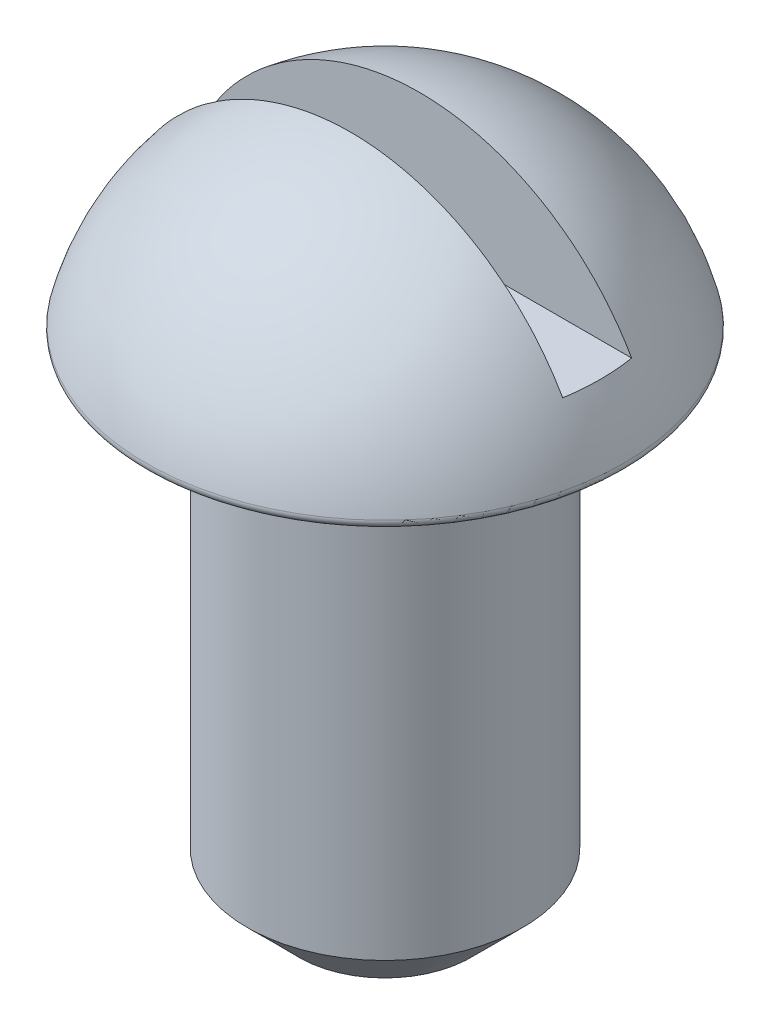
ISO-10303-21;
HEADER;
FILE_DESCRIPTION(('STEP AP214'),'2;1');
FILE_NAME('part.step','',(''),(''),'','','');
FILE_SCHEMA(('AUTOMOTIVE_DESIGN { 1 0 10303 214 1 1 1 1 }'));
ENDSEC;
DATA;
#1=APPLICATION_CONTEXT('core data for automotive mechanical design processes');
#2=APPLICATION_PROTOCOL_DEFINITION('international standard','automotive_design',2000,#1);
#3=PRODUCT_CONTEXT('',#1,'mechanical');
#4=PRODUCT('Part','Part','',(#3));
#5=PRODUCT_RELATED_PRODUCT_CATEGORY('part','',(#4));
#6=PRODUCT_DEFINITION_FORMATION('','',#4);
#7=PRODUCT_DEFINITION_CONTEXT('part definition',#1,'design');
#8=PRODUCT_DEFINITION('design','',#6,#7);
#9=PRODUCT_DEFINITION_SHAPE('','',#8);
#10=(LENGTH_UNIT() NAMED_UNIT(*) SI_UNIT(.MILLI.,.METRE.));
#11=(NAMED_UNIT(*) PLANE_ANGLE_UNIT() SI_UNIT($,.RADIAN.));
#12=(NAMED_UNIT(*) SI_UNIT($,.STERADIAN.) SOLID_ANGLE_UNIT());
#13=UNCERTAINTY_MEASURE_WITH_UNIT(LENGTH_MEASURE(1.E-05),#10,'distance_accuracy_value','');
#14=(GEOMETRIC_REPRESENTATION_CONTEXT(3) GLOBAL_UNCERTAINTY_ASSIGNED_CONTEXT((#13)) GLOBAL_UNIT_ASSIGNED_CONTEXT((#10,
#11,#12)) REPRESENTATION_CONTEXT('',''));
#15=CARTESIAN_POINT('',(0.,0.,0.));
#16=DIRECTION('',(0.,0.,1.));
#17=DIRECTION('',(1.,0.,0.));
#18=AXIS2_PLACEMENT_3D('',#15,#16,#17);
#19=CARTESIAN_POINT('',(0.,90.6868224936115,0.));
#20=DIRECTION('',(0.,1.,0.));
#21=DIRECTION('',(-1.,0.,0.));
#22=AXIS2_PLACEMENT_3D('',#19,#20,#21);
#23=DEGENERATE_TOROIDAL_SURFACE('',#22,0.0183246032973699,3.6,.F.);
#24=CARTESIAN_POINT('',(0.,91.5739557298984,0.));
#25=DIRECTION('',(0.,-1.,0.));
#26=DIRECTION('',(1.,0.,0.));
#27=AXIS2_PLACEMENT_3D('',#24,#25,#26);
#28=CIRCLE('',#27,3.47065728560304);
#29=CARTESIAN_POINT('',(3.47065728560304,91.5739557298984,0.));
#30=VERTEX_POINT('',#29);
#31=EDGE_CURVE('E109',#30,#30,#28,.F.);
#32=ORIENTED_EDGE('',*,*,#31,.T.);
#33=EDGE_LOOP('',(#32));
#34=FACE_BOUND('',#33,.T.);
#35=CARTESIAN_POINT('',(0.,92.4493131400015,0.));
#36=DIRECTION('',(0.,1.,0.));
#37=DIRECTION('',(0.,0.,1.));
#38=AXIS2_PLACEMENT_3D('',#35,#36,#37);
#39=CIRCLE('',#38,3.12072409358319);
#40=CARTESIAN_POINT('',(3.08040888004671,92.4493131400015,0.5));
#41=VERTEX_POINT('',#40);
#42=CARTESIAN_POINT('',(3.08040888004671,92.4493131400015,-0.5));
#43=VERTEX_POINT('',#42);
#44=EDGE_CURVE('E59',#41,#43,#39,.T.);
#45=ORIENTED_EDGE('',*,*,#44,.F.);
#46=CARTESIAN_POINT('',(0.,94.2493131400015,0.5));
#47=CARTESIAN_POINT('',(-0.168084506894695,94.2493074407577,0.5));
#48=CARTESIAN_POINT('',(-0.336238771593768,94.2369169879093,0.5));
#49=CARTESIAN_POINT('',(-0.670610119781154,94.1880328873502,0.5));
#50=CARTESIAN_POINT('',(-0.836792650530759,94.1513068778956,0.5));
#51=CARTESIAN_POINT('',(-1.16241747338006,94.0544656886014,0.5));
#52=CARTESIAN_POINT('',(-1.32185069076617,93.9943200624371,0.5));
#53=CARTESIAN_POINT('',(-1.65732504791068,93.8394864280937,0.5));
#54=CARTESIAN_POINT('',(-1.831454187301,93.7406178945025,0.5));
#55=CARTESIAN_POINT('',(-2.16072884420584,93.5151585277602,0.5));
#56=CARTESIAN_POINT('',(-2.31587144475736,93.3885634432033,0.5));
#57=CARTESIAN_POINT('',(-2.60339035009348,93.1106617040447,0.5));
#58=CARTESIAN_POINT('',(-2.73567365131913,92.9592587657414,0.5));
#59=CARTESIAN_POINT('',(-2.9729519694276,92.6364053708876,0.5));
#60=CARTESIAN_POINT('',(-3.07794743264177,92.4649552423039,0.5));
#61=CARTESIAN_POINT('',(-3.25771876546859,92.1067903356046,0.5));
#62=CARTESIAN_POINT('',(-3.33248171898337,91.9200690741419,0.5));
#63=CARTESIAN_POINT('',(-3.44960162336543,91.5367253690194,0.5));
#64=CARTESIAN_POINT('',(-3.49195845948841,91.3401028903037,0.5));
#65=CARTESIAN_POINT('',(-3.54306641018666,90.9425207970159,0.5));
#66=CARTESIAN_POINT('',(-3.55181467889931,90.7415608166072,0.5));
#67=CARTESIAN_POINT('',(-3.53544929214747,90.3410250922442,0.5));
#68=CARTESIAN_POINT('',(-3.51033574656349,90.1414493438002,0.5));
#69=CARTESIAN_POINT('',(-3.42695919898218,89.7493446057744,0.5));
#70=CARTESIAN_POINT('',(-3.3686958643025,89.5568156869334,0.5));
#71=CARTESIAN_POINT('',(-3.22067166805645,89.1842693358363,0.5));
#72=CARTESIAN_POINT('',(-3.13091031119911,89.0042521003738,0.5));
#73=CARTESIAN_POINT('',(-2.92243765385937,88.6618437190334,0.5));
#74=CARTESIAN_POINT('',(-2.80372638002803,88.4994525569293,0.5));
#75=CARTESIAN_POINT('',(-2.54073003846903,88.1969171743451,0.5));
#76=CARTESIAN_POINT('',(-2.39644649682133,88.0567716272557,0.5));
#77=CARTESIAN_POINT('',(-2.0864222931017,87.8027205748323,0.5));
#78=CARTESIAN_POINT('',(-1.92068536181631,87.6888105166457,0.5));
#79=CARTESIAN_POINT('',(-1.57239498175889,87.4904237683007,0.5));
#80=CARTESIAN_POINT('',(-1.38983810966954,87.4059530866651,0.5));
#81=CARTESIAN_POINT('',(-1.01318104943605,87.2689326437269,0.5));
#82=CARTESIAN_POINT('',(-0.819084259798824,87.2163735350874,0.5));
#83=CARTESIAN_POINT('',(-0.424827412550828,87.1448286537591,0.5));
#84=CARTESIAN_POINT('',(-0.224670005672249,87.1258284131488,0.5));
#85=CARTESIAN_POINT('',(0.173398565589074,87.123025922099,0.5));
#86=CARTESIAN_POINT('',(0.371306747607927,87.1387893781218,0.5));
#87=CARTESIAN_POINT('',(0.761712976674842,87.2032018619129,0.5));
#88=CARTESIAN_POINT('',(0.954209173723574,87.2518619958735,0.5));
#89=CARTESIAN_POINT('',(1.32793125839945,87.3802801394935,0.5));
#90=CARTESIAN_POINT('',(1.50918709967531,87.4599509830141,0.5));
#91=CARTESIAN_POINT('',(1.85599402911623,87.6481621017001,0.5));
#92=CARTESIAN_POINT('',(2.02154738348644,87.7566982023636,0.5));
#93=CARTESIAN_POINT('',(2.33476560390277,88.0014693565223,0.5));
#94=CARTESIAN_POINT('',(2.48212603204286,88.1380942549312,0.5));
#95=CARTESIAN_POINT('',(2.75185087223717,88.4341383369192,0.5));
#96=CARTESIAN_POINT('',(2.87421297674192,88.5935596224842,0.5));
#97=CARTESIAN_POINT('',(3.09054478730516,88.9307980695125,0.5));
#98=CARTESIAN_POINT('',(3.18449279736984,89.1086291496745,0.5));
#99=CARTESIAN_POINT('',(3.34120243732878,89.4775345576904,0.5));
#100=CARTESIAN_POINT('',(3.40396466075899,89.6686086334213,0.5));
#101=CARTESIAN_POINT('',(3.49653191755007,90.0586084451846,0.5));
#102=CARTESIAN_POINT('',(3.52633230562139,90.2575352838113,0.5));
#103=CARTESIAN_POINT('',(3.55211430733717,90.6575691036999,0.5));
#104=CARTESIAN_POINT('',(3.54809582104926,90.8586760914022,0.5));
#105=CARTESIAN_POINT('',(3.50635347771897,91.2573654451565,0.5));
#106=CARTESIAN_POINT('',(3.46862890805203,91.4549477365982,0.5));
#107=CARTESIAN_POINT('',(3.36054302413708,91.8409776639855,0.5));
#108=CARTESIAN_POINT('',(3.29018118089313,92.0294251518166,0.5));
#109=CARTESIAN_POINT('',(3.1188146167494,92.391837998125,0.5));
#110=CARTESIAN_POINT('',(3.01780888406156,92.5658028781794,0.5));
#111=CARTESIAN_POINT('',(2.7880330316396,92.8942869151572,0.5));
#112=CARTESIAN_POINT('',(2.65926574909071,93.0488080566453,0.5));
#113=CARTESIAN_POINT('',(2.3776530103899,93.333998766497,0.5));
#114=CARTESIAN_POINT('',(2.22481383368684,93.4646745360816,0.5));
#115=CARTESIAN_POINT('',(1.89927917613982,93.6985701370508,0.5));
#116=CARTESIAN_POINT('',(1.72657399903199,93.801776478931,0.5));
#117=CARTESIAN_POINT('',(1.36620928907914,93.9777327649598,0.5));
#118=CARTESIAN_POINT('',(1.17854266539399,94.0504681643125,0.5));
#119=CARTESIAN_POINT('',(0.79393033515201,94.1631994192497,0.5));
#120=CARTESIAN_POINT('',(0.597003655423001,94.2032595500915,0.5));
#121=CARTESIAN_POINT('',(0.266049173998156,94.2415625769748,0.5));
#122=CARTESIAN_POINT('',(0.133046440144509,94.2493176512091,0.5));
#123=CARTESIAN_POINT('',(0.,94.2493131400015,0.5));
#124=B_SPLINE_CURVE_WITH_KNOTS('',3,(#46,#47,#48,#49,#50,#51,#52,#53,#54,#55,#56,#57,#58,#59,
#60,#61,#62,#63,#64,#65,#66,#67,#68,#69,#70,#71,#72,#73,#74,#75,#76,#77,#78,#79,#80,#81,#82,#83,
#84,#85,#86,#87,#88,#89,#90,#91,#92,#93,#94,#95,#96,#97,#98,#99,#100,#101,#102,#103,#104,#105,
#106,#107,#108,#109,#110,#111,#112,#113,#114,#115,#116,#117,#118,#119,#120,#121,#122,#123),
.UNSPECIFIED.,.T.,.F.,(4,2,2,2,2,2,2,2,2,2,2,2,2,2,2,2,2,2,2,2,2,2,2,2,2,2,2,2,2,2,2,2,2,2,2,2,
2,2,4),(0.,0.503958033235567,1.01279868490143,1.52230306784988,2.12012977277567,
2.71804820874593,3.31834477020431,3.91863151234185,4.5191744419977,5.11971949805966,
5.72031540517507,6.32090936338052,6.92150934909141,7.52211877936602,8.1227276567263,
8.72330070352403,9.32376944945257,9.92436067828071,10.5247759007328,11.1249322085342,
11.7176334445617,12.3105348814531,12.9017816642348,13.4929429871905,14.0929422603714,
14.6929968933866,15.2935085567525,15.8940087905873,16.4945936417427,17.0951802675844,
17.6957795915168,18.2963886505059,18.8970175423306,19.4975850799325,20.0979962108194,
20.6987016458831,21.299693491848,21.8995002609849,22.2984056898251),.UNSPECIFIED.);
#125=CARTESIAN_POINT('',(-3.08040888004672,92.4493131400015,0.5));
#126=VERTEX_POINT('',#125);
#127=EDGE_CURVE('E57',#41,#126,#124,.T.);
#128=ORIENTED_EDGE('',*,*,#127,.T.);
#129=CARTESIAN_POINT('',(-3.08040888004672,92.4493131400015,-0.5));
#130=VERTEX_POINT('',#129);
#131=EDGE_CURVE('E58',#130,#126,#39,.T.);
#132=ORIENTED_EDGE('',*,*,#131,.F.);
#133=CARTESIAN_POINT('',(0.,94.2493131400015,-0.5));
#134=CARTESIAN_POINT('',(0.168084506894681,94.2493074407577,-0.5));
#135=CARTESIAN_POINT('',(0.336238771593755,94.2369169879093,-0.5));
#136=CARTESIAN_POINT('',(0.670610119781141,94.1880328873502,-0.5));
#137=CARTESIAN_POINT('',(0.836792650530746,94.1513068778956,-0.5));
#138=CARTESIAN_POINT('',(1.16241747338004,94.0544656886014,-0.5));
#139=CARTESIAN_POINT('',(1.32185069076616,93.9943200624371,-0.5));
#140=CARTESIAN_POINT('',(1.65732504791067,93.8394864280937,-0.5));
#141=CARTESIAN_POINT('',(1.83145418730098,93.7406178945025,-0.5));
#142=CARTESIAN_POINT('',(2.16072884420583,93.5151585277602,-0.5));
#143=CARTESIAN_POINT('',(2.31587144475735,93.3885634432033,-0.5));
#144=CARTESIAN_POINT('',(2.60339035009346,93.1106617040447,-0.5));
#145=CARTESIAN_POINT('',(2.73567365131911,92.9592587657414,-0.5));
#146=CARTESIAN_POINT('',(2.97295196942759,92.6364053708876,-0.5));
#147=CARTESIAN_POINT('',(3.07794743264176,92.4649552423039,-0.5));
#148=CARTESIAN_POINT('',(3.25771876546858,92.1067903356046,-0.5));
#149=CARTESIAN_POINT('',(3.33248171898336,91.9200690741419,-0.5));
#150=CARTESIAN_POINT('',(3.44960162336542,91.5367253690194,-0.5));
#151=CARTESIAN_POINT('',(3.4919584594884,91.3401028903037,-0.5));
#152=CARTESIAN_POINT('',(3.54306641018664,90.9425207970159,-0.5));
#153=CARTESIAN_POINT('',(3.5518146788993,90.7415608166072,-0.5));
#154=CARTESIAN_POINT('',(3.53544929214746,90.3410250922442,-0.5));
#155=CARTESIAN_POINT('',(3.51033574656348,90.1414493438002,-0.5));
#156=CARTESIAN_POINT('',(3.42695919898216,89.7493446057744,-0.5));
#157=CARTESIAN_POINT('',(3.36869586430249,89.5568156869334,-0.5));
#158=CARTESIAN_POINT('',(3.22067166805644,89.1842693358363,-0.5));
#159=CARTESIAN_POINT('',(3.1309103111991,89.0042521003738,-0.5));
#160=CARTESIAN_POINT('',(2.92243765385936,88.6618437190334,-0.5));
#161=CARTESIAN_POINT('',(2.80372638002802,88.4994525569293,-0.5));
#162=CARTESIAN_POINT('',(2.54073003846902,88.1969171743451,-0.5));
#163=CARTESIAN_POINT('',(2.39644649682131,88.0567716272557,-0.5));
#164=CARTESIAN_POINT('',(2.08642229310169,87.8027205748323,-0.5));
#165=CARTESIAN_POINT('',(1.9206853618163,87.6888105166457,-0.5));
#166=CARTESIAN_POINT('',(1.57239498175888,87.4904237683007,-0.5));
#167=CARTESIAN_POINT('',(1.38983810966952,87.4059530866651,-0.5));
#168=CARTESIAN_POINT('',(1.01318104943604,87.2689326437269,-0.5));
#169=CARTESIAN_POINT('',(0.819084259798812,87.2163735350874,-0.5));
#170=CARTESIAN_POINT('',(0.424827412550815,87.1448286537591,-0.5));
#171=CARTESIAN_POINT('',(0.224670005672236,87.1258284131488,-0.5));
#172=CARTESIAN_POINT('',(-0.173398565589087,87.123025922099,-0.5));
#173=CARTESIAN_POINT('',(-0.37130674760794,87.1387893781218,-0.5));
#174=CARTESIAN_POINT('',(-0.761712976674855,87.2032018619129,-0.5));
#175=CARTESIAN_POINT('',(-0.954209173723587,87.2518619958735,-0.5));
#176=CARTESIAN_POINT('',(-1.32793125839946,87.3802801394935,-0.5));
#177=CARTESIAN_POINT('',(-1.50918709967533,87.4599509830141,-0.5));
#178=CARTESIAN_POINT('',(-1.85599402911625,87.6481621017001,-0.5));
#179=CARTESIAN_POINT('',(-2.02154738348645,87.7566982023636,-0.5));
#180=CARTESIAN_POINT('',(-2.33476560390278,88.0014693565223,-0.5));
#181=CARTESIAN_POINT('',(-2.48212603204287,88.1380942549312,-0.5));
#182=CARTESIAN_POINT('',(-2.75185087223718,88.4341383369192,-0.5));
#183=CARTESIAN_POINT('',(-2.87421297674193,88.5935596224842,-0.5));
#184=CARTESIAN_POINT('',(-3.09054478730517,88.9307980695125,-0.5));
#185=CARTESIAN_POINT('',(-3.18449279736985,89.1086291496745,-0.5));
#186=CARTESIAN_POINT('',(-3.34120243732879,89.4775345576904,-0.5));
#187=CARTESIAN_POINT('',(-3.403964660759,89.6686086334213,-0.5));
#188=CARTESIAN_POINT('',(-3.49653191755008,90.0586084451845,-0.5));
#189=CARTESIAN_POINT('',(-3.5263323056214,90.2575352838113,-0.5));
#190=CARTESIAN_POINT('',(-3.55211430733718,90.6575691036999,-0.5));
#191=CARTESIAN_POINT('',(-3.54809582104927,90.8586760914022,-0.5));
#192=CARTESIAN_POINT('',(-3.50635347771898,91.2573654451565,-0.5));
#193=CARTESIAN_POINT('',(-3.46862890805204,91.4549477365982,-0.5));
#194=CARTESIAN_POINT('',(-3.36054302413709,91.8409776639855,-0.5));
#195=CARTESIAN_POINT('',(-3.29018118089314,92.0294251518166,-0.5));
#196=CARTESIAN_POINT('',(-3.11881461674941,92.391837998125,-0.5));
#197=CARTESIAN_POINT('',(-3.01780888406158,92.5658028781794,-0.5));
#198=CARTESIAN_POINT('',(-2.78803303163962,92.8942869151572,-0.5));
#199=CARTESIAN_POINT('',(-2.65926574909073,93.0488080566453,-0.5));
#200=CARTESIAN_POINT('',(-2.37765301038991,93.333998766497,-0.5));
#201=CARTESIAN_POINT('',(-2.22481383368686,93.4646745360816,-0.5));
#202=CARTESIAN_POINT('',(-1.89927917613984,93.6985701370508,-0.5));
#203=CARTESIAN_POINT('',(-1.726573999032,93.801776478931,-0.5));
#204=CARTESIAN_POINT('',(-1.36620928907916,93.9777327649598,-0.5));
#205=CARTESIAN_POINT('',(-1.17854266539401,94.0504681643125,-0.5));
#206=CARTESIAN_POINT('',(-0.793930335152023,94.1631994192497,-0.5));
#207=CARTESIAN_POINT('',(-0.597003655423015,94.2032595500915,-0.5));
#208=CARTESIAN_POINT('',(-0.26604917399817,94.2415625769748,-0.5));
#209=CARTESIAN_POINT('',(-0.133046440144523,94.2493176512091,-0.5));
#210=CARTESIAN_POINT('',(0.,94.2493131400015,-0.5));
#211=B_SPLINE_CURVE_WITH_KNOTS('',3,(#133,#134,#135,#136,#137,#138,#139,#140,#141,#142,#143,
#144,#145,#146,#147,#148,#149,#150,#151,#152,#153,#154,#155,#156,#157,#158,#159,#160,#161,#162,
#163,#164,#165,#166,#167,#168,#169,#170,#171,#172,#173,#174,#175,#176,#177,#178,#179,#180,#181,
#182,#183,#184,#185,#186,#187,#188,#189,#190,#191,#192,#193,#194,#195,#196,#197,#198,#199,#200,
#201,#202,#203,#204,#205,#206,#207,#208,#209,#210),.UNSPECIFIED.,.T.,.F.,(4,2,2,2,2,2,2,2,2,2,2,
2,2,2,2,2,2,2,2,2,2,2,2,2,2,2,2,2,2,2,2,2,2,2,2,2,2,2,4),(0.,0.503958033235567,1.01279868490143,
1.52230306784988,2.12012977277567,2.71804820874593,3.31834477020431,3.91863151234185,
4.5191744419977,5.11971949805966,5.72031540517507,6.32090936338052,6.92150934909141,
7.52211877936602,8.1227276567263,8.72330070352403,9.32376944945257,9.92436067828071,
10.5247759007328,11.1249322085342,11.7176334445617,12.3105348814531,12.9017816642348,
13.4929429871905,14.0929422603714,14.6929968933866,15.2935085567525,15.8940087905873,
16.4945936417427,17.0951802675844,17.6957795915168,18.2963886505059,18.8970175423306,
19.4975850799325,20.0979962108194,20.6987016458831,21.299693491848,21.8995002609849,
22.2984056898251),.UNSPECIFIED.);
#212=EDGE_CURVE('E51',#130,#43,#211,.T.);
#213=ORIENTED_EDGE('',*,*,#212,.T.);
#214=EDGE_LOOP('',(#45,#128,#132,#213));
#215=FACE_BOUND('',#214,.T.);
#216=ADVANCED_FACE('F29',(#34,#215),#23,.F.);
#217=CARTESIAN_POINT('',(2.,91.4493131400015,0.));
#218=DIRECTION('',(0.,1.,0.));
#219=DIRECTION('',(-1.,0.,0.));
#220=AXIS2_PLACEMENT_3D('',#217,#218,#219);
#221=PLANE('',#220);
#222=CARTESIAN_POINT('',(0.,91.4493131400015,0.));
#223=DIRECTION('',(0.,1.,0.));
#224=DIRECTION('',(-1.,0.,0.));
#225=AXIS2_PLACEMENT_3D('',#222,#223,#224);
#226=CIRCLE('',#225,3.37374112202248);
#227=CARTESIAN_POINT('',(-3.37374112202248,91.4493131400015,0.));
#228=VERTEX_POINT('',#227);
#229=EDGE_CURVE('E104',#228,#228,#226,.F.);
#230=ORIENTED_EDGE('',*,*,#229,.T.);
#231=EDGE_LOOP('',(#230));
#232=FACE_BOUND('',#231,.T.);
#233=CARTESIAN_POINT('',(0.,91.4493131400015,0.));
#234=DIRECTION('',(0.,1.,0.));
#235=DIRECTION('',(-1.,0.,0.));
#236=AXIS2_PLACEMENT_3D('',#233,#234,#235);
#237=CIRCLE('',#236,2.00000000000001);
#238=CARTESIAN_POINT('',(-2.00000000000002,91.4493131400015,0.));
#239=VERTEX_POINT('',#238);
#240=EDGE_CURVE('E66',#239,#239,#237,.T.);
#241=ORIENTED_EDGE('',*,*,#240,.T.);
#242=EDGE_LOOP('',(#241));
#243=FACE_BOUND('',#242,.T.);
#244=ADVANCED_FACE('F92',(#232,#243),#221,.F.);
#245=CARTESIAN_POINT('',(0.,125.763182897862,0.));
#246=DIRECTION('',(0.,1.,0.));
#247=DIRECTION('',(-1.,0.,0.));
#248=AXIS2_PLACEMENT_3D('',#245,#246,#247);
#249=CYLINDRICAL_SURFACE('',#248,2.00000000000001);
#250=CARTESIAN_POINT('',(0.,84.9993131400015,0.));
#251=DIRECTION('',(0.,1.,0.));
#252=DIRECTION('',(-1.,0.,0.));
#253=AXIS2_PLACEMENT_3D('',#250,#251,#252);
#254=CIRCLE('',#253,2.00000000000001);
#255=CARTESIAN_POINT('',(-2.00000000000002,84.9993131400015,0.));
#256=VERTEX_POINT('',#255);
#257=EDGE_CURVE('E37',#256,#256,#254,.T.);
#258=ORIENTED_EDGE('',*,*,#257,.T.);
#259=EDGE_LOOP('',(#258));
#260=FACE_BOUND('',#259,.T.);
#261=ORIENTED_EDGE('',*,*,#240,.F.);
#262=EDGE_LOOP('',(#261));
#263=FACE_BOUND('',#262,.T.);
#264=ADVANCED_FACE('F89',(#260,#263),#249,.T.);
#265=CARTESIAN_POINT('',(2.00000000000001,84.2493131400015,0.));
#266=DIRECTION('',(0.,1.,0.));
#267=DIRECTION('',(-1.,0.,0.));
#268=AXIS2_PLACEMENT_3D('',#265,#266,#267);
#269=PLANE('',#268);
#270=CARTESIAN_POINT('',(0.,84.2493131400015,0.));
#271=DIRECTION('',(0.,1.,0.));
#272=DIRECTION('',(-1.,0.,0.));
#273=AXIS2_PLACEMENT_3D('',#270,#271,#272);
#274=CIRCLE('',#273,1.25000000000001);
#275=CARTESIAN_POINT('',(-1.25000000000001,84.2493131400015,0.));
#276=VERTEX_POINT('',#275);
#277=EDGE_CURVE('E11',#276,#276,#274,.F.);
#278=ORIENTED_EDGE('',*,*,#277,.T.);
#279=EDGE_LOOP('',(#278));
#280=FACE_BOUND('',#279,.T.);
#281=ADVANCED_FACE('F86',(#280),#269,.F.);
#282=CARTESIAN_POINT('',(-3.50000000000001,92.4493131400015,0.5));
#283=DIRECTION('',(0.,1.,0.));
#284=DIRECTION('',(0.,0.,1.));
#285=AXIS2_PLACEMENT_3D('',#282,#283,#284);
#286=PLANE('',#285);
#287=ORIENTED_EDGE('',*,*,#44,.T.);
#288=DIRECTION('',(-1.,0.,0.));
#289=VECTOR('',#288,1.);
#290=CARTESIAN_POINT('',(-3.50000000000001,92.4493131400015,-0.5));
#291=LINE('',#290,#289);
#292=EDGE_CURVE('E44',#43,#130,#291,.T.);
#293=ORIENTED_EDGE('',*,*,#292,.T.);
#294=ORIENTED_EDGE('',*,*,#131,.T.);
#295=DIRECTION('',(1.,0.,0.));
#296=VECTOR('',#295,1.);
#297=CARTESIAN_POINT('',(-3.50000000000001,92.4493131400015,0.5));
#298=LINE('',#297,#296);
#299=EDGE_CURVE('E65',#126,#41,#298,.T.);
#300=ORIENTED_EDGE('',*,*,#299,.T.);
#301=EDGE_LOOP('',(#287,#293,#294,#300));
#302=FACE_BOUND('',#301,.T.);
#303=ADVANCED_FACE('F64',(#302),#286,.T.);
#304=CARTESIAN_POINT('',(-3.50000000000001,92.4493131400015,-0.5));
#305=DIRECTION('',(0.,0.,-1.));
#306=DIRECTION('',(-1.,0.,0.));
#307=AXIS2_PLACEMENT_3D('',#304,#305,#306);
#308=PLANE('',#307);
#309=ORIENTED_EDGE('',*,*,#212,.F.);
#310=ORIENTED_EDGE('',*,*,#292,.F.);
#311=EDGE_LOOP('',(#309,#310));
#312=FACE_BOUND('',#311,.T.);
#313=ADVANCED_FACE('F83',(#312),#308,.F.);
#314=CARTESIAN_POINT('',(-3.50000000000001,92.4493131400015,0.5));
#315=DIRECTION('',(0.,0.,1.));
#316=DIRECTION('',(1.,0.,0.));
#317=AXIS2_PLACEMENT_3D('',#314,#315,#316);
#318=PLANE('',#317);
#319=ORIENTED_EDGE('',*,*,#127,.F.);
#320=ORIENTED_EDGE('',*,*,#299,.F.);
#321=EDGE_LOOP('',(#319,#320));
#322=FACE_BOUND('',#321,.T.);
#323=ADVANCED_FACE('F68',(#322),#318,.F.);
#324=CARTESIAN_POINT('',(0.,91.5493131400015,0.));
#325=DIRECTION('',(0.,1.,0.));
#326=DIRECTION('',(-1.,0.,0.));
#327=AXIS2_PLACEMENT_3D('',#324,#325,#326);
#328=TOROIDAL_SURFACE('',#327,3.37374112202248,0.1);
#329=ORIENTED_EDGE('',*,*,#229,.F.);
#330=EDGE_LOOP('',(#329));
#331=FACE_BOUND('',#330,.T.);
#332=ORIENTED_EDGE('',*,*,#31,.F.);
#333=EDGE_LOOP('',(#332));
#334=FACE_BOUND('',#333,.T.);
#335=ADVANCED_FACE('F82',(#331,#334),#328,.T.);
#336=CARTESIAN_POINT('',(0.,84.9993131400015,0.));
#337=DIRECTION('',(0.,1.,0.));
#338=DIRECTION('',(-1.,0.,0.));
#339=AXIS2_PLACEMENT_3D('',#336,#337,#338);
#340=CONICAL_SURFACE('',#339,2.00000000000001,0.78539816339745);
#341=ORIENTED_EDGE('',*,*,#277,.F.);
#342=EDGE_LOOP('',(#341));
#343=FACE_BOUND('',#342,.T.);
#344=ORIENTED_EDGE('',*,*,#257,.F.);
#345=EDGE_LOOP('',(#344));
#346=FACE_BOUND('',#345,.T.);
#347=ADVANCED_FACE('F115',(#343,#346),#340,.T.);
#348=CLOSED_SHELL('',(#216,#244,#264,#281,#303,#313,#323,#335,#347));
#349=MANIFOLD_SOLID_BREP('B2',#348);
#350=ADVANCED_BREP_SHAPE_REPRESENTATION('',(#18,#349),#14);
#351=SHAPE_DEFINITION_REPRESENTATION(#9,#350);
ENDSEC;
END-ISO-10303-21;
